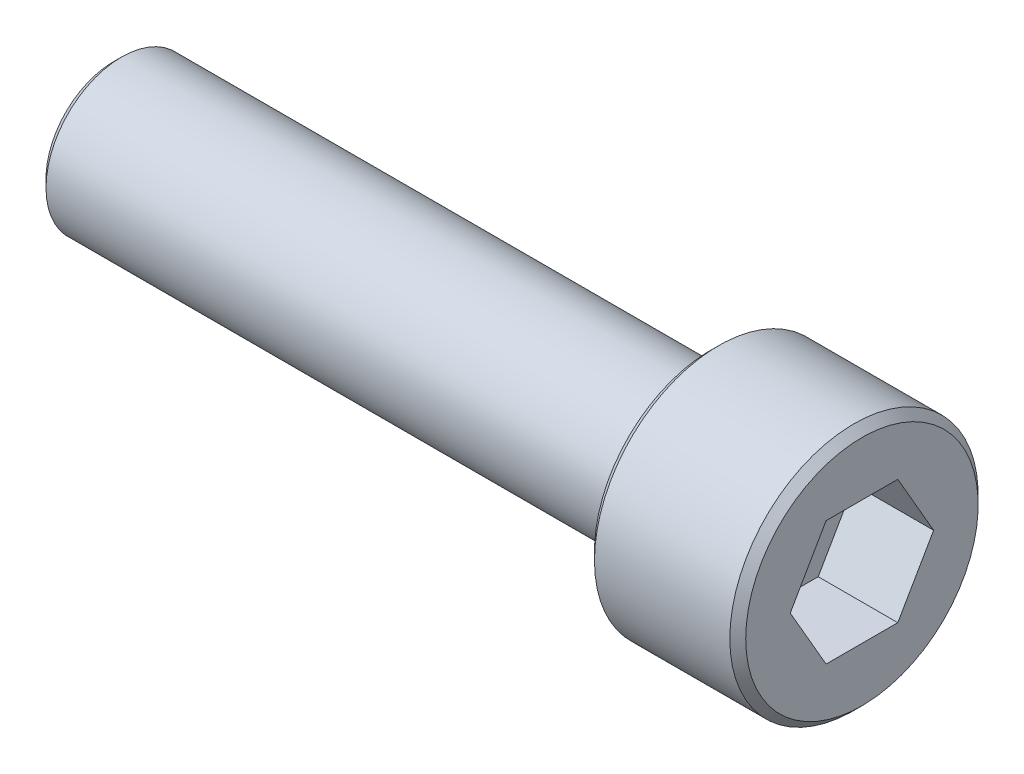
ISO-10303-21;
HEADER;
FILE_DESCRIPTION(('STEP AP214'),'2;1');
FILE_NAME('part.step','',(''),(''),'','','');
FILE_SCHEMA(('AUTOMOTIVE_DESIGN { 1 0 10303 214 1 1 1 1 }'));
ENDSEC;
DATA;
#1=APPLICATION_CONTEXT('core data for automotive mechanical design processes');
#2=APPLICATION_PROTOCOL_DEFINITION('international standard','automotive_design',2000,#1);
#3=PRODUCT_CONTEXT('',#1,'mechanical');
#4=PRODUCT('Part','Part','',(#3));
#5=PRODUCT_RELATED_PRODUCT_CATEGORY('part','',(#4));
#6=PRODUCT_DEFINITION_FORMATION('','',#4);
#7=PRODUCT_DEFINITION_CONTEXT('part definition',#1,'design');
#8=PRODUCT_DEFINITION('design','',#6,#7);
#9=PRODUCT_DEFINITION_SHAPE('','',#8);
#10=(LENGTH_UNIT() NAMED_UNIT(*) SI_UNIT(.MILLI.,.METRE.));
#11=(NAMED_UNIT(*) PLANE_ANGLE_UNIT() SI_UNIT($,.RADIAN.));
#12=(NAMED_UNIT(*) SI_UNIT($,.STERADIAN.) SOLID_ANGLE_UNIT());
#13=UNCERTAINTY_MEASURE_WITH_UNIT(LENGTH_MEASURE(1.E-05),#10,'distance_accuracy_value','');
#14=(GEOMETRIC_REPRESENTATION_CONTEXT(3) GLOBAL_UNCERTAINTY_ASSIGNED_CONTEXT((#13)) GLOBAL_UNIT_ASSIGNED_CONTEXT((#10,
#11,#12)) REPRESENTATION_CONTEXT('',''));
#15=CARTESIAN_POINT('',(0.,0.,0.));
#16=DIRECTION('',(0.,0.,1.));
#17=DIRECTION('',(1.,0.,0.));
#18=AXIS2_PLACEMENT_3D('',#15,#16,#17);
#19=CARTESIAN_POINT('',(21.3359999999995,-4.44089209850063E-13,-2.28769270663681));
#20=DIRECTION('',(-1.,0.,0.));
#21=DIRECTION('',(0.,0.,1.));
#22=AXIS2_PLACEMENT_3D('',#19,#20,#21);
#23=PLANE('',#22);
#24=DIRECTION('',(0.,0.,1.));
#25=VECTOR('',#24,1.);
#26=CARTESIAN_POINT('',(21.3359999999994,1.98119999999966,-1.1438463533183));
#27=LINE('',#26,#25);
#28=CARTESIAN_POINT('',(21.3359999999994,1.98119999999964,-1.14384635331825));
#29=VERTEX_POINT('',#28);
#30=CARTESIAN_POINT('',(21.3359999999996,1.9811999999996,1.14384635331861));
#31=VERTEX_POINT('',#30);
#32=EDGE_CURVE('E73',#29,#31,#27,.T.);
#33=ORIENTED_EDGE('',*,*,#32,.T.);
#34=DIRECTION('',(0.,-0.866025403784439,0.5));
#35=VECTOR('',#34,1.);
#36=CARTESIAN_POINT('',(21.336,1.9811999999996,1.1438463533186));
#37=LINE('',#36,#35);
#38=CARTESIAN_POINT('',(21.3359999999999,-2.67189299584188E-13,2.28769270663706));
#39=VERTEX_POINT('',#38);
#40=EDGE_CURVE('E70',#31,#39,#37,.T.);
#41=ORIENTED_EDGE('',*,*,#40,.T.);
#42=DIRECTION('',(0.,-0.866025403784439,-0.5));
#43=VECTOR('',#42,1.);
#44=CARTESIAN_POINT('',(21.336,-2.22044604925031E-13,2.28769270663712));
#45=LINE('',#44,#43);
#46=CARTESIAN_POINT('',(21.3359999999999,-1.98120000000035,1.1438463533186));
#47=VERTEX_POINT('',#46);
#48=EDGE_CURVE('E67',#39,#47,#45,.T.);
#49=ORIENTED_EDGE('',*,*,#48,.T.);
#50=DIRECTION('',(0.,0.,-1.));
#51=VECTOR('',#50,1.);
#52=CARTESIAN_POINT('',(21.336,-1.98120000000032,1.14384635331856));
#53=LINE('',#52,#51);
#54=CARTESIAN_POINT('',(21.3359999999999,-1.98120000000038,-1.14384635331838));
#55=VERTEX_POINT('',#54);
#56=EDGE_CURVE('E90',#47,#55,#53,.T.);
#57=ORIENTED_EDGE('',*,*,#56,.T.);
#58=DIRECTION('',(0.,0.866025403784439,-0.5));
#59=VECTOR('',#58,1.);
#60=CARTESIAN_POINT('',(21.3360000000001,-1.98120000000043,-1.14384635331838));
#61=LINE('',#60,#59);
#62=CARTESIAN_POINT('',(21.3359999999998,-4.26287636772514E-13,-2.28769270663681));
#63=VERTEX_POINT('',#62);
#64=EDGE_CURVE('E134',#55,#63,#61,.T.);
#65=ORIENTED_EDGE('',*,*,#64,.T.);
#66=DIRECTION('',(0.,0.866025403784438,0.5));
#67=VECTOR('',#66,1.);
#68=CARTESIAN_POINT('',(21.3359999999995,-4.44089209850063E-13,-2.28769270663681));
#69=LINE('',#68,#67);
#70=EDGE_CURVE('E129',#63,#29,#69,.T.);
#71=ORIENTED_EDGE('',*,*,#70,.T.);
#72=EDGE_LOOP('',(#33,#41,#49,#57,#65,#71));
#73=FACE_BOUND('',#72,.T.);
#74=ADVANCED_FACE('F16',(#73),#23,.F.);
#75=CARTESIAN_POINT('',(21.336,1.9811999999996,1.1438463533186));
#76=DIRECTION('',(0.,0.5,0.866025403784439));
#77=DIRECTION('',(0.,-0.866025403784439,0.5));
#78=AXIS2_PLACEMENT_3D('',#75,#76,#77);
#79=PLANE('',#78);
#80=DIRECTION('',(1.,0.,0.));
#81=VECTOR('',#80,1.);
#82=CARTESIAN_POINT('',(21.336,-2.87245555614786E-13,2.28769270663708));
#83=LINE('',#82,#81);
#84=CARTESIAN_POINT('',(23.8759999999997,-2.94962824390546E-13,2.28769270663707));
#85=VERTEX_POINT('',#84);
#86=EDGE_CURVE('E76',#85,#39,#83,.F.);
#87=ORIENTED_EDGE('',*,*,#86,.T.);
#88=ORIENTED_EDGE('',*,*,#40,.F.);
#89=DIRECTION('',(1.,0.,0.));
#90=VECTOR('',#89,1.);
#91=CARTESIAN_POINT('',(21.3359999999994,1.98119999999966,1.1438463533186));
#92=LINE('',#91,#90);
#93=CARTESIAN_POINT('',(23.8759999999997,1.98119999999961,1.14384635331864));
#94=VERTEX_POINT('',#93);
#95=EDGE_CURVE('E124',#31,#94,#92,.T.);
#96=ORIENTED_EDGE('',*,*,#95,.T.);
#97=DIRECTION('',(0.,-0.866025403784447,0.499999999999986));
#98=VECTOR('',#97,1.);
#99=CARTESIAN_POINT('',(23.8759999999989,1.98119999999963,1.14384635331874));
#100=LINE('',#99,#98);
#101=EDGE_CURVE('E81',#94,#85,#100,.T.);
#102=ORIENTED_EDGE('',*,*,#101,.T.);
#103=EDGE_LOOP('',(#87,#88,#96,#102));
#104=FACE_BOUND('',#103,.T.);
#105=ADVANCED_FACE('F79',(#104),#79,.F.);
#106=CARTESIAN_POINT('',(21.336,-2.22044604925031E-13,2.28769270663712));
#107=DIRECTION('',(0.,-0.5,0.866025403784439));
#108=DIRECTION('',(0.,-0.866025403784439,-0.5));
#109=AXIS2_PLACEMENT_3D('',#106,#107,#108);
#110=PLANE('',#109);
#111=DIRECTION('',(1.,0.,0.));
#112=VECTOR('',#111,1.);
#113=CARTESIAN_POINT('',(21.336,-1.98120000000032,1.14384635331877));
#114=LINE('',#113,#112);
#115=CARTESIAN_POINT('',(23.8759999999998,-1.98120000000035,1.14384635331867));
#116=VERTEX_POINT('',#115);
#117=EDGE_CURVE('E87',#116,#47,#114,.F.);
#118=ORIENTED_EDGE('',*,*,#117,.T.);
#119=ORIENTED_EDGE('',*,*,#48,.F.);
#120=ORIENTED_EDGE('',*,*,#86,.F.);
#121=DIRECTION('',(0.,-0.866025403784464,-0.499999999999956));
#122=VECTOR('',#121,1.);
#123=CARTESIAN_POINT('',(23.8759999999989,-3.33066907387547E-13,2.28769270663716));
#124=LINE('',#123,#122);
#125=EDGE_CURVE('E121',#85,#116,#124,.T.);
#126=ORIENTED_EDGE('',*,*,#125,.T.);
#127=EDGE_LOOP('',(#118,#119,#120,#126));
#128=FACE_BOUND('',#127,.T.);
#129=ADVANCED_FACE('F85',(#128),#110,.F.);
#130=CARTESIAN_POINT('',(21.336,-1.98120000000032,1.14384635331856));
#131=DIRECTION('',(0.,-1.,0.));
#132=DIRECTION('',(0.,0.,-1.));
#133=AXIS2_PLACEMENT_3D('',#130,#131,#132);
#134=PLANE('',#133);
#135=DIRECTION('',(1.,0.,0.));
#136=VECTOR('',#135,1.);
#137=CARTESIAN_POINT('',(21.3360000000001,-1.98120000000044,-1.14384635331838));
#138=LINE('',#137,#136);
#139=CARTESIAN_POINT('',(23.8759999999996,-1.98120000000037,-1.14384635331836));
#140=VERTEX_POINT('',#139);
#141=EDGE_CURVE('E136',#140,#55,#138,.F.);
#142=ORIENTED_EDGE('',*,*,#141,.T.);
#143=ORIENTED_EDGE('',*,*,#56,.F.);
#144=ORIENTED_EDGE('',*,*,#117,.F.);
#145=DIRECTION('',(0.,0.,1.));
#146=VECTOR('',#145,1.);
#147=CARTESIAN_POINT('',(23.8759999999989,-1.9812000000004,3.19189119579733E-13));
#148=LINE('',#147,#146);
#149=EDGE_CURVE('E119',#116,#140,#148,.F.);
#150=ORIENTED_EDGE('',*,*,#149,.T.);
#151=EDGE_LOOP('',(#142,#143,#144,#150));
#152=FACE_BOUND('',#151,.T.);
#153=ADVANCED_FACE('F141',(#152),#134,.F.);
#154=CARTESIAN_POINT('',(21.3360000000001,-1.98120000000043,-1.14384635331838));
#155=DIRECTION('',(0.,-0.5,-0.866025403784439));
#156=DIRECTION('',(0.,0.866025403784439,-0.5));
#157=AXIS2_PLACEMENT_3D('',#154,#155,#156);
#158=PLANE('',#157);
#159=DIRECTION('',(1.,0.,0.));
#160=VECTOR('',#159,1.);
#161=CARTESIAN_POINT('',(21.3359999999995,-3.33525160559159E-13,-2.28769270663675));
#162=LINE('',#161,#160);
#163=CARTESIAN_POINT('',(23.8759999999993,-4.05520202472328E-13,-2.28769270663679));
#164=VERTEX_POINT('',#163);
#165=EDGE_CURVE('E131',#164,#63,#162,.F.);
#166=ORIENTED_EDGE('',*,*,#165,.T.);
#167=ORIENTED_EDGE('',*,*,#64,.F.);
#168=ORIENTED_EDGE('',*,*,#141,.F.);
#169=DIRECTION('',(0.,0.866025403784464,-0.499999999999956));
#170=VECTOR('',#169,1.);
#171=CARTESIAN_POINT('',(23.8759999999989,-1.9812000000004,-1.14384635331832));
#172=LINE('',#171,#170);
#173=EDGE_CURVE('E117',#140,#164,#172,.T.);
#174=ORIENTED_EDGE('',*,*,#173,.T.);
#175=EDGE_LOOP('',(#166,#167,#168,#174));
#176=FACE_BOUND('',#175,.T.);
#177=ADVANCED_FACE('F145',(#176),#158,.F.);
#178=CARTESIAN_POINT('',(21.3359999999995,-4.44089209850063E-13,-2.28769270663681));
#179=DIRECTION('',(0.,0.5,-0.866025403784438));
#180=DIRECTION('',(0.,0.866025403784438,0.5));
#181=AXIS2_PLACEMENT_3D('',#178,#179,#180);
#182=PLANE('',#181);
#183=DIRECTION('',(1.,0.,0.));
#184=VECTOR('',#183,1.);
#185=CARTESIAN_POINT('',(21.3359999999994,1.98119999999966,-1.14384635331814));
#186=LINE('',#185,#184);
#187=CARTESIAN_POINT('',(23.8759999999994,1.98119999999966,-1.14384635331821));
#188=VERTEX_POINT('',#187);
#189=EDGE_CURVE('E127',#188,#29,#186,.F.);
#190=ORIENTED_EDGE('',*,*,#189,.T.);
#191=ORIENTED_EDGE('',*,*,#70,.F.);
#192=ORIENTED_EDGE('',*,*,#165,.F.);
#193=DIRECTION('',(0.,0.86602540378443,0.500000000000015));
#194=VECTOR('',#193,1.);
#195=CARTESIAN_POINT('',(23.8759999999989,-3.60822483003176E-13,-2.2876927066367));
#196=LINE('',#195,#194);
#197=EDGE_CURVE('E34',#164,#188,#196,.T.);
#198=ORIENTED_EDGE('',*,*,#197,.T.);
#199=EDGE_LOOP('',(#190,#191,#192,#198));
#200=FACE_BOUND('',#199,.T.);
#201=ADVANCED_FACE('F147',(#200),#182,.F.);
#202=CARTESIAN_POINT('',(21.3359999999994,1.98119999999966,-1.1438463533183));
#203=DIRECTION('',(0.,1.,0.));
#204=DIRECTION('',(0.,0.,1.));
#205=AXIS2_PLACEMENT_3D('',#202,#203,#204);
#206=PLANE('',#205);
#207=ORIENTED_EDGE('',*,*,#95,.F.);
#208=ORIENTED_EDGE('',*,*,#32,.F.);
#209=ORIENTED_EDGE('',*,*,#189,.F.);
#210=DIRECTION('',(0.,0.,1.));
#211=VECTOR('',#210,1.);
#212=CARTESIAN_POINT('',(23.8759999999989,1.98119999999968,3.19189119579733E-13));
#213=LINE('',#212,#211);
#214=EDGE_CURVE('E113',#188,#94,#213,.T.);
#215=ORIENTED_EDGE('',*,*,#214,.T.);
#216=EDGE_LOOP('',(#207,#208,#209,#215));
#217=FACE_BOUND('',#216,.T.);
#218=ADVANCED_FACE('F150',(#217),#206,.F.);
#219=CARTESIAN_POINT('',(23.8759999999989,3.96239999999967,3.19189119579733E-13));
#220=DIRECTION('',(-1.,0.,0.));
#221=DIRECTION('',(0.,0.,1.));
#222=AXIS2_PLACEMENT_3D('',#219,#220,#221);
#223=PLANE('',#222);
#224=ORIENTED_EDGE('',*,*,#197,.F.);
#225=ORIENTED_EDGE('',*,*,#173,.F.);
#226=ORIENTED_EDGE('',*,*,#149,.F.);
#227=ORIENTED_EDGE('',*,*,#125,.F.);
#228=ORIENTED_EDGE('',*,*,#101,.F.);
#229=ORIENTED_EDGE('',*,*,#214,.F.);
#230=EDGE_LOOP('',(#224,#225,#226,#227,#228,#229));
#231=FACE_BOUND('',#230,.T.);
#232=CARTESIAN_POINT('',(23.8759999999161,-4.16333634234441E-13,1.80411241501588E-13));
#233=DIRECTION('',(-1.,0.,0.));
#234=DIRECTION('',(0.,0.,1.));
#235=AXIS2_PLACEMENT_3D('',#232,#233,#234);
#236=CIRCLE('',#235,3.70839999999344);
#237=CARTESIAN_POINT('',(23.8759999999161,-4.16333634234441E-13,3.70839999999362));
#238=VERTEX_POINT('',#237);
#239=EDGE_CURVE('E19',#238,#238,#236,.T.);
#240=ORIENTED_EDGE('',*,*,#239,.F.);
#241=EDGE_LOOP('',(#240));
#242=FACE_BOUND('',#241,.T.);
#243=ADVANCED_FACE('F152',(#231,#242),#223,.F.);
#244=CARTESIAN_POINT('',(23.6219999998752,-4.16333634234441E-13,1.80411241501588E-13));
#245=DIRECTION('',(-1.,0.,0.));
#246=DIRECTION('',(0.,0.,1.));
#247=AXIS2_PLACEMENT_3D('',#244,#245,#246);
#248=CONICAL_SURFACE('',#247,3.96240000009111,0.785398163509345);
#249=ORIENTED_EDGE('',*,*,#239,.T.);
#250=EDGE_LOOP('',(#249));
#251=FACE_BOUND('',#250,.T.);
#252=CARTESIAN_POINT('',(23.622,0.,0.));
#253=DIRECTION('',(-1.,0.,0.));
#254=DIRECTION('',(0.,0.,1.));
#255=AXIS2_PLACEMENT_3D('',#252,#253,#254);
#256=CIRCLE('',#255,3.9624);
#257=CARTESIAN_POINT('',(23.622,0.,3.9624));
#258=VERTEX_POINT('',#257);
#259=EDGE_CURVE('E104',#258,#258,#256,.T.);
#260=ORIENTED_EDGE('',*,*,#259,.F.);
#261=EDGE_LOOP('',(#260));
#262=FACE_BOUND('',#261,.T.);
#263=ADVANCED_FACE('F155',(#251,#262),#248,.T.);
#264=CARTESIAN_POINT('',(0.,0.,0.));
#265=DIRECTION('',(-1.,0.,0.));
#266=DIRECTION('',(0.,0.,1.));
#267=AXIS2_PLACEMENT_3D('',#264,#265,#266);
#268=CYLINDRICAL_SURFACE('',#267,3.9624);
#269=ORIENTED_EDGE('',*,*,#259,.T.);
#270=EDGE_LOOP('',(#269));
#271=FACE_BOUND('',#270,.T.);
#272=CARTESIAN_POINT('',(19.3040000000337,0.,1.38806470958905E-13));
#273=DIRECTION('',(1.,0.,0.));
#274=DIRECTION('',(0.,0.,-1.));
#275=AXIS2_PLACEMENT_3D('',#272,#273,#274);
#276=CIRCLE('',#275,3.96239999997774);
#277=CARTESIAN_POINT('',(19.3040000000337,0.,-3.96239999997761));
#278=VERTEX_POINT('',#277);
#279=EDGE_CURVE('E100',#278,#278,#276,.F.);
#280=ORIENTED_EDGE('',*,*,#279,.F.);
#281=EDGE_LOOP('',(#280));
#282=FACE_BOUND('',#281,.T.);
#283=ADVANCED_FACE('F162',(#271,#282),#268,.T.);
#284=CARTESIAN_POINT('',(19.3040000000337,0.,1.38777878078145E-13));
#285=DIRECTION('',(1.,0.,0.));
#286=DIRECTION('',(0.,0.,-1.));
#287=AXIS2_PLACEMENT_3D('',#284,#285,#286);
#288=CONICAL_SURFACE('',#287,3.96239999997774,0.785398163397448);
#289=CARTESIAN_POINT('',(19.0500000000497,0.,1.38777878078145E-13));
#290=DIRECTION('',(1.,0.,0.));
#291=DIRECTION('',(0.,0.,-1.));
#292=AXIS2_PLACEMENT_3D('',#289,#290,#291);
#293=CIRCLE('',#292,3.70839999999376);
#294=CARTESIAN_POINT('',(19.0500000000497,0.,-3.70839999999362));
#295=VERTEX_POINT('',#294);
#296=EDGE_CURVE('E98',#295,#295,#293,.T.);
#297=ORIENTED_EDGE('',*,*,#296,.T.);
#298=EDGE_LOOP('',(#297));
#299=FACE_BOUND('',#298,.T.);
#300=ORIENTED_EDGE('',*,*,#279,.T.);
#301=EDGE_LOOP('',(#300));
#302=FACE_BOUND('',#301,.T.);
#303=ADVANCED_FACE('F168',(#299,#302),#288,.T.);
#304=CARTESIAN_POINT('',(0.,0.,0.));
#305=DIRECTION('',(1.,0.,0.));
#306=DIRECTION('',(0.,0.,-1.));
#307=AXIS2_PLACEMENT_3D('',#304,#305,#306);
#308=PLANE('',#307);
#309=CARTESIAN_POINT('',(-5.68440693821115E-11,0.,0.));
#310=DIRECTION('',(1.,0.,0.));
#311=DIRECTION('',(0.,0.,-1.));
#312=AXIS2_PLACEMENT_3D('',#309,#310,#311);
#313=CIRCLE('',#312,2.15899999994917);
#314=CARTESIAN_POINT('',(-5.68438511150952E-11,0.,-2.15899999994917));
#315=VERTEX_POINT('',#314);
#316=EDGE_CURVE('E96',#315,#315,#313,.T.);
#317=ORIENTED_EDGE('',*,*,#316,.F.);
#318=EDGE_LOOP('',(#317));
#319=FACE_BOUND('',#318,.T.);
#320=ADVANCED_FACE('F174',(#319),#308,.F.);
#321=CARTESIAN_POINT('',(19.05,2.41299999999969,2.63677968348475E-13));
#322=DIRECTION('',(1.,0.,0.));
#323=DIRECTION('',(0.,0.,-1.));
#324=AXIS2_PLACEMENT_3D('',#321,#322,#323);
#325=PLANE('',#324);
#326=CARTESIAN_POINT('',(19.05,0.,0.));
#327=DIRECTION('',(-1.,0.,0.));
#328=DIRECTION('',(0.,0.,1.));
#329=AXIS2_PLACEMENT_3D('',#326,#327,#328);
#330=CIRCLE('',#329,2.413);
#331=CARTESIAN_POINT('',(19.05,0.,2.413));
#332=VERTEX_POINT('',#331);
#333=EDGE_CURVE('E25',#332,#332,#330,.T.);
#334=ORIENTED_EDGE('',*,*,#333,.F.);
#335=EDGE_LOOP('',(#334));
#336=FACE_BOUND('',#335,.T.);
#337=ORIENTED_EDGE('',*,*,#296,.F.);
#338=EDGE_LOOP('',(#337));
#339=FACE_BOUND('',#338,.T.);
#340=ADVANCED_FACE('F184',(#336,#339),#325,.F.);
#341=CARTESIAN_POINT('',(0.253999999927146,0.,0.));
#342=DIRECTION('',(1.,0.,0.));
#343=DIRECTION('',(0.,0.,-1.));
#344=AXIS2_PLACEMENT_3D('',#341,#342,#343);
#345=CONICAL_SURFACE('',#344,2.41299999993316,0.785398163397448);
#346=CARTESIAN_POINT('',(0.253999999999976,0.,0.));
#347=DIRECTION('',(-1.,0.,0.));
#348=DIRECTION('',(0.,0.,1.));
#349=AXIS2_PLACEMENT_3D('',#346,#347,#348);
#350=CIRCLE('',#349,2.413);
#351=CARTESIAN_POINT('',(0.253999999999976,0.,2.413));
#352=VERTEX_POINT('',#351);
#353=EDGE_CURVE('E11',#352,#352,#350,.F.);
#354=ORIENTED_EDGE('',*,*,#353,.F.);
#355=EDGE_LOOP('',(#354));
#356=FACE_BOUND('',#355,.T.);
#357=ORIENTED_EDGE('',*,*,#316,.T.);
#358=EDGE_LOOP('',(#357));
#359=FACE_BOUND('',#358,.T.);
#360=ADVANCED_FACE('F178',(#356,#359),#345,.T.);
#361=CARTESIAN_POINT('',(0.,0.,0.));
#362=DIRECTION('',(-1.,0.,0.));
#363=DIRECTION('',(0.,0.,1.));
#364=AXIS2_PLACEMENT_3D('',#361,#362,#363);
#365=CYLINDRICAL_SURFACE('',#364,2.413);
#366=ORIENTED_EDGE('',*,*,#353,.T.);
#367=EDGE_LOOP('',(#366));
#368=FACE_BOUND('',#367,.T.);
#369=ORIENTED_EDGE('',*,*,#333,.T.);
#370=EDGE_LOOP('',(#369));
#371=FACE_BOUND('',#370,.T.);
#372=ADVANCED_FACE('F176',(#368,#371),#365,.T.);
#373=CLOSED_SHELL('',(#74,#105,#129,#153,#177,#201,#218,#243,#263,#283,#303,#320,#340,#360,#372));
#374=MANIFOLD_SOLID_BREP('B1',#373);
#375=ADVANCED_BREP_SHAPE_REPRESENTATION('',(#18,#374),#14);
#376=SHAPE_DEFINITION_REPRESENTATION(#9,#375);
ENDSEC;
END-ISO-10303-21;
